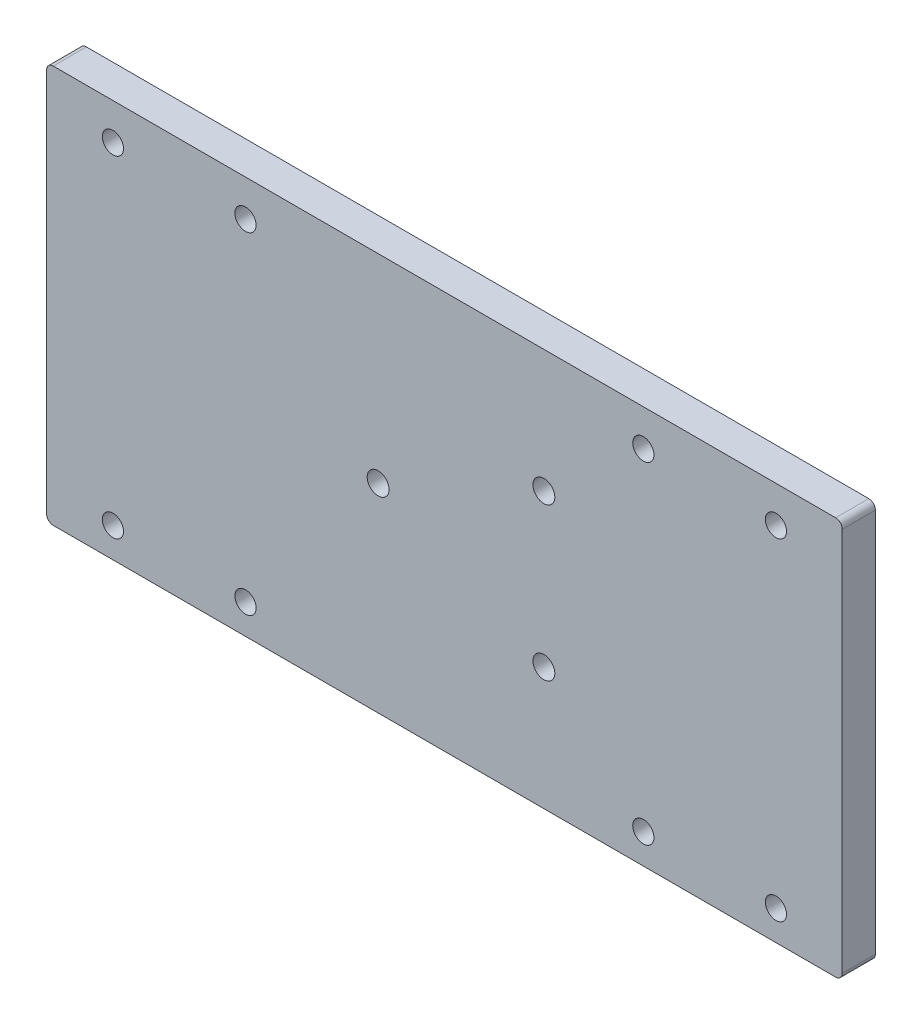
ISO-10303-21;
HEADER;
FILE_DESCRIPTION(('STEP AP214'),'2;1');
FILE_NAME('part.step','',(''),(''),'','','');
FILE_SCHEMA(('AUTOMOTIVE_DESIGN { 1 0 10303 214 1 1 1 1 }'));
ENDSEC;
DATA;
#1=APPLICATION_CONTEXT('core data for automotive mechanical design processes');
#2=APPLICATION_PROTOCOL_DEFINITION('international standard','automotive_design',2000,#1);
#3=PRODUCT_CONTEXT('',#1,'mechanical');
#4=PRODUCT('Part','Part','',(#3));
#5=PRODUCT_RELATED_PRODUCT_CATEGORY('part','',(#4));
#6=PRODUCT_DEFINITION_FORMATION('','',#4);
#7=PRODUCT_DEFINITION_CONTEXT('part definition',#1,'design');
#8=PRODUCT_DEFINITION('design','',#6,#7);
#9=PRODUCT_DEFINITION_SHAPE('','',#8);
#10=(LENGTH_UNIT() NAMED_UNIT(*) SI_UNIT(.MILLI.,.METRE.));
#11=(NAMED_UNIT(*) PLANE_ANGLE_UNIT() SI_UNIT($,.RADIAN.));
#12=(NAMED_UNIT(*) SI_UNIT($,.STERADIAN.) SOLID_ANGLE_UNIT());
#13=UNCERTAINTY_MEASURE_WITH_UNIT(LENGTH_MEASURE(1.E-05),#10,'distance_accuracy_value','');
#14=(GEOMETRIC_REPRESENTATION_CONTEXT(3) GLOBAL_UNCERTAINTY_ASSIGNED_CONTEXT((#13)) GLOBAL_UNIT_ASSIGNED_CONTEXT((#10,
#11,#12)) REPRESENTATION_CONTEXT('',''));
#15=CARTESIAN_POINT('',(0.,0.,0.));
#16=DIRECTION('',(0.,0.,1.));
#17=DIRECTION('',(1.,0.,0.));
#18=AXIS2_PLACEMENT_3D('',#15,#16,#17);
#19=CARTESIAN_POINT('',(20.,5.50000000000001,5.));
#20=DIRECTION('',(-1.,0.,0.));
#21=DIRECTION('',(0.,0.,1.));
#22=AXIS2_PLACEMENT_3D('',#19,#20,#21);
#23=PLANE('',#22);
#24=DIRECTION('',(0.,1.,0.));
#25=VECTOR('',#24,1.);
#26=CARTESIAN_POINT('',(20.,5.50000000000001,5.));
#27=LINE('',#26,#25);
#28=CARTESIAN_POINT('',(20.,-53.5,5.));
#29=VERTEX_POINT('',#28);
#30=CARTESIAN_POINT('',(20.,4.5,5.));
#31=VERTEX_POINT('',#30);
#32=EDGE_CURVE('E131',#29,#31,#27,.T.);
#33=ORIENTED_EDGE('',*,*,#32,.F.);
#34=DIRECTION('',(0.,0.,-1.));
#35=VECTOR('',#34,1.);
#36=CARTESIAN_POINT('',(20.,-53.5,5.));
#37=LINE('',#36,#35);
#38=CARTESIAN_POINT('',(20.,-53.5,0.));
#39=VERTEX_POINT('',#38);
#40=EDGE_CURVE('E116',#29,#39,#37,.T.);
#41=ORIENTED_EDGE('',*,*,#40,.T.);
#42=DIRECTION('',(0.,1.,0.));
#43=VECTOR('',#42,1.);
#44=CARTESIAN_POINT('',(20.,5.50000000000001,0.));
#45=LINE('',#44,#43);
#46=CARTESIAN_POINT('',(20.,4.5,0.));
#47=VERTEX_POINT('',#46);
#48=EDGE_CURVE('E128',#39,#47,#45,.T.);
#49=ORIENTED_EDGE('',*,*,#48,.T.);
#50=DIRECTION('',(0.,0.,-1.));
#51=VECTOR('',#50,1.);
#52=CARTESIAN_POINT('',(20.,4.5,5.));
#53=LINE('',#52,#51);
#54=EDGE_CURVE('E133',#47,#31,#53,.F.);
#55=ORIENTED_EDGE('',*,*,#54,.T.);
#56=EDGE_LOOP('',(#33,#41,#49,#55));
#57=FACE_BOUND('',#56,.T.);
#58=ADVANCED_FACE('F45',(#57),#23,.F.);
#59=CARTESIAN_POINT('',(20.,5.50000000000001,5.));
#60=DIRECTION('',(0.,-1.,0.));
#61=DIRECTION('',(1.,0.,0.));
#62=AXIS2_PLACEMENT_3D('',#59,#60,#61);
#63=PLANE('',#62);
#64=DIRECTION('',(-1.,0.,0.));
#65=VECTOR('',#64,1.);
#66=CARTESIAN_POINT('',(20.,5.50000000000001,5.));
#67=LINE('',#66,#65);
#68=CARTESIAN_POINT('',(19.,5.50000000000001,5.));
#69=VERTEX_POINT('',#68);
#70=CARTESIAN_POINT('',(-99.,5.50000000000002,5.));
#71=VERTEX_POINT('',#70);
#72=EDGE_CURVE('E175',#69,#71,#67,.T.);
#73=ORIENTED_EDGE('',*,*,#72,.F.);
#74=DIRECTION('',(0.,0.,-1.));
#75=VECTOR('',#74,1.);
#76=CARTESIAN_POINT('',(19.,5.50000000000001,5.));
#77=LINE('',#76,#75);
#78=CARTESIAN_POINT('',(19.,5.50000000000001,0.));
#79=VERTEX_POINT('',#78);
#80=EDGE_CURVE('E11',#69,#79,#77,.T.);
#81=ORIENTED_EDGE('',*,*,#80,.T.);
#82=DIRECTION('',(-1.,0.,0.));
#83=VECTOR('',#82,1.);
#84=CARTESIAN_POINT('',(20.,5.50000000000001,0.));
#85=LINE('',#84,#83);
#86=CARTESIAN_POINT('',(-99.,5.50000000000002,0.));
#87=VERTEX_POINT('',#86);
#88=EDGE_CURVE('E138',#79,#87,#85,.T.);
#89=ORIENTED_EDGE('',*,*,#88,.T.);
#90=DIRECTION('',(0.,0.,-1.));
#91=VECTOR('',#90,1.);
#92=CARTESIAN_POINT('',(-99.,5.50000000000002,5.));
#93=LINE('',#92,#91);
#94=EDGE_CURVE('E53',#87,#71,#93,.F.);
#95=ORIENTED_EDGE('',*,*,#94,.T.);
#96=EDGE_LOOP('',(#73,#81,#89,#95));
#97=FACE_BOUND('',#96,.T.);
#98=ADVANCED_FACE('F174',(#97),#63,.F.);
#99=CARTESIAN_POINT('',(-100.,5.50000000000002,5.));
#100=DIRECTION('',(1.,0.,0.));
#101=DIRECTION('',(0.,0.,-1.));
#102=AXIS2_PLACEMENT_3D('',#99,#100,#101);
#103=PLANE('',#102);
#104=DIRECTION('',(0.,-1.,0.));
#105=VECTOR('',#104,1.);
#106=CARTESIAN_POINT('',(-100.,5.50000000000002,0.));
#107=LINE('',#106,#105);
#108=CARTESIAN_POINT('',(-100.,4.50000000000002,0.));
#109=VERTEX_POINT('',#108);
#110=CARTESIAN_POINT('',(-100.,-53.5,0.));
#111=VERTEX_POINT('',#110);
#112=EDGE_CURVE('E142',#109,#111,#107,.T.);
#113=ORIENTED_EDGE('',*,*,#112,.T.);
#114=DIRECTION('',(0.,0.,-1.));
#115=VECTOR('',#114,1.);
#116=CARTESIAN_POINT('',(-100.,-53.5,5.));
#117=LINE('',#116,#115);
#118=CARTESIAN_POINT('',(-100.,-53.5,5.));
#119=VERTEX_POINT('',#118);
#120=EDGE_CURVE('E60',#111,#119,#117,.F.);
#121=ORIENTED_EDGE('',*,*,#120,.T.);
#122=DIRECTION('',(0.,-1.,0.));
#123=VECTOR('',#122,1.);
#124=CARTESIAN_POINT('',(-100.,5.50000000000002,5.));
#125=LINE('',#124,#123);
#126=CARTESIAN_POINT('',(-100.,4.50000000000002,5.));
#127=VERTEX_POINT('',#126);
#128=EDGE_CURVE('E181',#127,#119,#125,.T.);
#129=ORIENTED_EDGE('',*,*,#128,.F.);
#130=DIRECTION('',(0.,0.,-1.));
#131=VECTOR('',#130,1.);
#132=CARTESIAN_POINT('',(-100.,4.50000000000002,5.));
#133=LINE('',#132,#131);
#134=EDGE_CURVE('E168',#127,#109,#133,.T.);
#135=ORIENTED_EDGE('',*,*,#134,.T.);
#136=EDGE_LOOP('',(#113,#121,#129,#135));
#137=FACE_BOUND('',#136,.T.);
#138=ADVANCED_FACE('F185',(#137),#103,.F.);
#139=CARTESIAN_POINT('',(20.,-54.5,5.));
#140=DIRECTION('',(0.,1.,0.));
#141=DIRECTION('',(-1.,0.,0.));
#142=AXIS2_PLACEMENT_3D('',#139,#140,#141);
#143=PLANE('',#142);
#144=DIRECTION('',(1.,0.,0.));
#145=VECTOR('',#144,1.);
#146=CARTESIAN_POINT('',(20.,-54.5,0.));
#147=LINE('',#146,#145);
#148=CARTESIAN_POINT('',(-99.,-54.5,0.));
#149=VERTEX_POINT('',#148);
#150=CARTESIAN_POINT('',(19.,-54.5,0.));
#151=VERTEX_POINT('',#150);
#152=EDGE_CURVE('E152',#149,#151,#147,.T.);
#153=ORIENTED_EDGE('',*,*,#152,.T.);
#154=DIRECTION('',(0.,0.,-1.));
#155=VECTOR('',#154,1.);
#156=CARTESIAN_POINT('',(19.,-54.5,5.));
#157=LINE('',#156,#155);
#158=CARTESIAN_POINT('',(19.,-54.5,5.));
#159=VERTEX_POINT('',#158);
#160=EDGE_CURVE('E117',#151,#159,#157,.F.);
#161=ORIENTED_EDGE('',*,*,#160,.T.);
#162=DIRECTION('',(1.,0.,0.));
#163=VECTOR('',#162,1.);
#164=CARTESIAN_POINT('',(20.,-54.5,5.));
#165=LINE('',#164,#163);
#166=CARTESIAN_POINT('',(-99.,-54.5,5.));
#167=VERTEX_POINT('',#166);
#168=EDGE_CURVE('E148',#167,#159,#165,.T.);
#169=ORIENTED_EDGE('',*,*,#168,.F.);
#170=DIRECTION('',(0.,0.,-1.));
#171=VECTOR('',#170,1.);
#172=CARTESIAN_POINT('',(-99.,-54.5,5.));
#173=LINE('',#172,#171);
#174=EDGE_CURVE('E122',#167,#149,#173,.T.);
#175=ORIENTED_EDGE('',*,*,#174,.T.);
#176=EDGE_LOOP('',(#153,#161,#169,#175));
#177=FACE_BOUND('',#176,.T.);
#178=ADVANCED_FACE('F192',(#177),#143,.F.);
#179=CARTESIAN_POINT('',(0.,0.,5.));
#180=DIRECTION('',(0.,0.,-1.));
#181=DIRECTION('',(-1.,0.,0.));
#182=AXIS2_PLACEMENT_3D('',#179,#180,#181);
#183=PLANE('',#182);
#184=CARTESIAN_POINT('',(-10.,-50.,5.));
#185=DIRECTION('',(0.,0.,-1.));
#186=DIRECTION('',(-1.,0.,0.));
#187=AXIS2_PLACEMENT_3D('',#184,#185,#186);
#188=CIRCLE('',#187,1.6);
#189=CARTESIAN_POINT('',(-11.6,-50.,5.));
#190=VERTEX_POINT('',#189);
#191=EDGE_CURVE('E232',#190,#190,#188,.F.);
#192=ORIENTED_EDGE('',*,*,#191,.F.);
#193=EDGE_LOOP('',(#192));
#194=FACE_BOUND('',#193,.T.);
#195=CARTESIAN_POINT('',(-90.,-50.,5.));
#196=DIRECTION('',(0.,0.,-1.));
#197=DIRECTION('',(-1.,0.,0.));
#198=AXIS2_PLACEMENT_3D('',#195,#196,#197);
#199=CIRCLE('',#198,1.59999999999999);
#200=CARTESIAN_POINT('',(-91.6,-50.,5.));
#201=VERTEX_POINT('',#200);
#202=EDGE_CURVE('E231',#201,#201,#199,.F.);
#203=ORIENTED_EDGE('',*,*,#202,.F.);
#204=EDGE_LOOP('',(#203));
#205=FACE_BOUND('',#204,.T.);
#206=CARTESIAN_POINT('',(-70.,-50.,5.));
#207=DIRECTION('',(0.,0.,-1.));
#208=DIRECTION('',(-1.,0.,0.));
#209=AXIS2_PLACEMENT_3D('',#206,#207,#208);
#210=CIRCLE('',#209,1.59999999999999);
#211=CARTESIAN_POINT('',(-71.6,-50.,5.));
#212=VERTEX_POINT('',#211);
#213=EDGE_CURVE('E220',#212,#212,#210,.F.);
#214=ORIENTED_EDGE('',*,*,#213,.F.);
#215=EDGE_LOOP('',(#214));
#216=FACE_BOUND('',#215,.T.);
#217=CARTESIAN_POINT('',(-70.,0.,5.));
#218=DIRECTION('',(0.,0.,-1.));
#219=DIRECTION('',(-1.,0.,0.));
#220=AXIS2_PLACEMENT_3D('',#217,#218,#219);
#221=CIRCLE('',#220,1.60000000000001);
#222=CARTESIAN_POINT('',(-71.6,0.,5.));
#223=VERTEX_POINT('',#222);
#224=EDGE_CURVE('E219',#223,#223,#221,.F.);
#225=ORIENTED_EDGE('',*,*,#224,.F.);
#226=EDGE_LOOP('',(#225));
#227=FACE_BOUND('',#226,.T.);
#228=CARTESIAN_POINT('',(9.99999999999999,-50.,5.));
#229=DIRECTION('',(0.,0.,-1.));
#230=DIRECTION('',(-1.,0.,0.));
#231=AXIS2_PLACEMENT_3D('',#228,#229,#230);
#232=CIRCLE('',#231,1.6);
#233=CARTESIAN_POINT('',(8.4,-50.,5.));
#234=VERTEX_POINT('',#233);
#235=EDGE_CURVE('E250',#234,#234,#232,.F.);
#236=ORIENTED_EDGE('',*,*,#235,.F.);
#237=EDGE_LOOP('',(#236));
#238=FACE_BOUND('',#237,.T.);
#239=CARTESIAN_POINT('',(10.,0.,5.));
#240=DIRECTION('',(0.,0.,-1.));
#241=DIRECTION('',(-1.,0.,0.));
#242=AXIS2_PLACEMENT_3D('',#239,#240,#241);
#243=CIRCLE('',#242,1.6);
#244=CARTESIAN_POINT('',(8.4,0.,5.));
#245=VERTEX_POINT('',#244);
#246=EDGE_CURVE('E243',#245,#245,#243,.F.);
#247=ORIENTED_EDGE('',*,*,#246,.F.);
#248=EDGE_LOOP('',(#247));
#249=FACE_BOUND('',#248,.T.);
#250=CARTESIAN_POINT('',(-10.,0.,5.));
#251=DIRECTION('',(0.,0.,-1.));
#252=DIRECTION('',(-1.,0.,0.));
#253=AXIS2_PLACEMENT_3D('',#250,#251,#252);
#254=CIRCLE('',#253,1.6);
#255=CARTESIAN_POINT('',(-11.6,0.,5.));
#256=VERTEX_POINT('',#255);
#257=EDGE_CURVE('E244',#256,#256,#254,.F.);
#258=ORIENTED_EDGE('',*,*,#257,.F.);
#259=EDGE_LOOP('',(#258));
#260=FACE_BOUND('',#259,.T.);
#261=CARTESIAN_POINT('',(-90.,0.,5.));
#262=DIRECTION('',(0.,0.,-1.));
#263=DIRECTION('',(-1.,0.,0.));
#264=AXIS2_PLACEMENT_3D('',#261,#262,#263);
#265=CIRCLE('',#264,1.60000000000001);
#266=CARTESIAN_POINT('',(-91.6,0.,5.));
#267=VERTEX_POINT('',#266);
#268=EDGE_CURVE('E199',#267,#267,#265,.F.);
#269=ORIENTED_EDGE('',*,*,#268,.F.);
#270=EDGE_LOOP('',(#269));
#271=FACE_BOUND('',#270,.T.);
#272=CARTESIAN_POINT('',(-25.,-13.,5.));
#273=DIRECTION('',(0.,0.,1.));
#274=DIRECTION('',(1.,0.,0.));
#275=AXIS2_PLACEMENT_3D('',#272,#273,#274);
#276=CIRCLE('',#275,1.65);
#277=CARTESIAN_POINT('',(-23.35,-13.,5.));
#278=VERTEX_POINT('',#277);
#279=EDGE_CURVE('E139',#278,#278,#276,.T.);
#280=ORIENTED_EDGE('',*,*,#279,.F.);
#281=EDGE_LOOP('',(#280));
#282=FACE_BOUND('',#281,.T.);
#283=CARTESIAN_POINT('',(-50.,-24.5,5.));
#284=DIRECTION('',(0.,0.,1.));
#285=DIRECTION('',(1.,0.,0.));
#286=AXIS2_PLACEMENT_3D('',#283,#284,#285);
#287=CIRCLE('',#286,1.65);
#288=CARTESIAN_POINT('',(-48.35,-24.5,5.));
#289=VERTEX_POINT('',#288);
#290=EDGE_CURVE('E202',#289,#289,#287,.T.);
#291=ORIENTED_EDGE('',*,*,#290,.F.);
#292=EDGE_LOOP('',(#291));
#293=FACE_BOUND('',#292,.T.);
#294=CARTESIAN_POINT('',(-25.,-36.,5.));
#295=DIRECTION('',(0.,0.,1.));
#296=DIRECTION('',(1.,0.,0.));
#297=AXIS2_PLACEMENT_3D('',#294,#295,#296);
#298=CIRCLE('',#297,1.65000000000001);
#299=CARTESIAN_POINT('',(-23.35,-36.,5.));
#300=VERTEX_POINT('',#299);
#301=EDGE_CURVE('E195',#300,#300,#298,.T.);
#302=ORIENTED_EDGE('',*,*,#301,.F.);
#303=EDGE_LOOP('',(#302));
#304=FACE_BOUND('',#303,.T.);
#305=ORIENTED_EDGE('',*,*,#168,.T.);
#306=CARTESIAN_POINT('',(19.,-53.5,5.));
#307=DIRECTION('',(0.,0.,-1.));
#308=DIRECTION('',(-1.,0.,0.));
#309=AXIS2_PLACEMENT_3D('',#306,#307,#308);
#310=CIRCLE('',#309,1.);
#311=EDGE_CURVE('E166',#159,#29,#310,.F.);
#312=ORIENTED_EDGE('',*,*,#311,.T.);
#313=ORIENTED_EDGE('',*,*,#32,.T.);
#314=CARTESIAN_POINT('',(19.,4.5,5.));
#315=DIRECTION('',(0.,0.,-1.));
#316=DIRECTION('',(-1.,0.,0.));
#317=AXIS2_PLACEMENT_3D('',#314,#315,#316);
#318=CIRCLE('',#317,1.);
#319=EDGE_CURVE('E162',#31,#69,#318,.F.);
#320=ORIENTED_EDGE('',*,*,#319,.T.);
#321=ORIENTED_EDGE('',*,*,#72,.T.);
#322=CARTESIAN_POINT('',(-99.,4.50000000000002,5.));
#323=DIRECTION('',(0.,0.,-1.));
#324=DIRECTION('',(-1.,0.,0.));
#325=AXIS2_PLACEMENT_3D('',#322,#323,#324);
#326=CIRCLE('',#325,1.);
#327=EDGE_CURVE('E67',#71,#127,#326,.F.);
#328=ORIENTED_EDGE('',*,*,#327,.T.);
#329=ORIENTED_EDGE('',*,*,#128,.T.);
#330=CARTESIAN_POINT('',(-99.,-53.5,5.));
#331=DIRECTION('',(0.,0.,-1.));
#332=DIRECTION('',(-1.,0.,0.));
#333=AXIS2_PLACEMENT_3D('',#330,#331,#332);
#334=CIRCLE('',#333,1.);
#335=EDGE_CURVE('E164',#119,#167,#334,.F.);
#336=ORIENTED_EDGE('',*,*,#335,.T.);
#337=EDGE_LOOP('',(#305,#312,#313,#320,#321,#328,#329,#336));
#338=FACE_BOUND('',#337,.T.);
#339=ADVANCED_FACE('F179',(#194,#205,#216,#227,#238,#249,#260,#271,#282,#293,#304,#338),#183,.F.);
#340=CARTESIAN_POINT('',(0.,0.,0.));
#341=DIRECTION('',(0.,0.,-1.));
#342=DIRECTION('',(-1.,0.,0.));
#343=AXIS2_PLACEMENT_3D('',#340,#341,#342);
#344=PLANE('',#343);
#345=CARTESIAN_POINT('',(-10.,-50.,0.));
#346=DIRECTION('',(0.,0.,-1.));
#347=DIRECTION('',(-1.,0.,0.));
#348=AXIS2_PLACEMENT_3D('',#345,#346,#347);
#349=CIRCLE('',#348,1.6);
#350=CARTESIAN_POINT('',(-11.6,-50.,0.));
#351=VERTEX_POINT('',#350);
#352=EDGE_CURVE('E228',#351,#351,#349,.T.);
#353=ORIENTED_EDGE('',*,*,#352,.F.);
#354=EDGE_LOOP('',(#353));
#355=FACE_BOUND('',#354,.T.);
#356=CARTESIAN_POINT('',(-90.,-50.,0.));
#357=DIRECTION('',(0.,0.,-1.));
#358=DIRECTION('',(-1.,0.,0.));
#359=AXIS2_PLACEMENT_3D('',#356,#357,#358);
#360=CIRCLE('',#359,1.59999999999999);
#361=CARTESIAN_POINT('',(-91.6,-50.,0.));
#362=VERTEX_POINT('',#361);
#363=EDGE_CURVE('E223',#362,#362,#360,.T.);
#364=ORIENTED_EDGE('',*,*,#363,.F.);
#365=EDGE_LOOP('',(#364));
#366=FACE_BOUND('',#365,.T.);
#367=CARTESIAN_POINT('',(-70.,-50.,0.));
#368=DIRECTION('',(0.,0.,-1.));
#369=DIRECTION('',(-1.,0.,0.));
#370=AXIS2_PLACEMENT_3D('',#367,#368,#369);
#371=CIRCLE('',#370,1.59999999999999);
#372=CARTESIAN_POINT('',(-71.6,-50.,0.));
#373=VERTEX_POINT('',#372);
#374=EDGE_CURVE('E216',#373,#373,#371,.T.);
#375=ORIENTED_EDGE('',*,*,#374,.F.);
#376=EDGE_LOOP('',(#375));
#377=FACE_BOUND('',#376,.T.);
#378=CARTESIAN_POINT('',(-70.,0.,0.));
#379=DIRECTION('',(0.,0.,-1.));
#380=DIRECTION('',(-1.,0.,0.));
#381=AXIS2_PLACEMENT_3D('',#378,#379,#380);
#382=CIRCLE('',#381,1.60000000000001);
#383=CARTESIAN_POINT('',(-71.6,0.,0.));
#384=VERTEX_POINT('',#383);
#385=EDGE_CURVE('E215',#384,#384,#382,.T.);
#386=ORIENTED_EDGE('',*,*,#385,.F.);
#387=EDGE_LOOP('',(#386));
#388=FACE_BOUND('',#387,.T.);
#389=CARTESIAN_POINT('',(9.99999999999999,-50.,0.));
#390=DIRECTION('',(0.,0.,-1.));
#391=DIRECTION('',(-1.,0.,0.));
#392=AXIS2_PLACEMENT_3D('',#389,#390,#391);
#393=CIRCLE('',#392,1.6);
#394=CARTESIAN_POINT('',(8.4,-50.,0.));
#395=VERTEX_POINT('',#394);
#396=EDGE_CURVE('E235',#395,#395,#393,.T.);
#397=ORIENTED_EDGE('',*,*,#396,.F.);
#398=EDGE_LOOP('',(#397));
#399=FACE_BOUND('',#398,.T.);
#400=CARTESIAN_POINT('',(10.,0.,0.));
#401=DIRECTION('',(0.,0.,-1.));
#402=DIRECTION('',(-1.,0.,0.));
#403=AXIS2_PLACEMENT_3D('',#400,#401,#402);
#404=CIRCLE('',#403,1.6);
#405=CARTESIAN_POINT('',(8.4,0.,0.));
#406=VERTEX_POINT('',#405);
#407=EDGE_CURVE('E247',#406,#406,#404,.T.);
#408=ORIENTED_EDGE('',*,*,#407,.F.);
#409=EDGE_LOOP('',(#408));
#410=FACE_BOUND('',#409,.T.);
#411=CARTESIAN_POINT('',(-10.,0.,0.));
#412=DIRECTION('',(0.,0.,-1.));
#413=DIRECTION('',(-1.,0.,0.));
#414=AXIS2_PLACEMENT_3D('',#411,#412,#413);
#415=CIRCLE('',#414,1.6);
#416=CARTESIAN_POINT('',(-11.6,0.,0.));
#417=VERTEX_POINT('',#416);
#418=EDGE_CURVE('E240',#417,#417,#415,.T.);
#419=ORIENTED_EDGE('',*,*,#418,.F.);
#420=EDGE_LOOP('',(#419));
#421=FACE_BOUND('',#420,.T.);
#422=CARTESIAN_POINT('',(-90.,0.,0.));
#423=DIRECTION('',(0.,0.,-1.));
#424=DIRECTION('',(-1.,0.,0.));
#425=AXIS2_PLACEMENT_3D('',#422,#423,#424);
#426=CIRCLE('',#425,1.60000000000001);
#427=CARTESIAN_POINT('',(-91.6,0.,0.));
#428=VERTEX_POINT('',#427);
#429=EDGE_CURVE('E212',#428,#428,#426,.T.);
#430=ORIENTED_EDGE('',*,*,#429,.F.);
#431=EDGE_LOOP('',(#430));
#432=FACE_BOUND('',#431,.T.);
#433=CARTESIAN_POINT('',(-25.,-13.,0.));
#434=DIRECTION('',(0.,0.,-1.));
#435=DIRECTION('',(-1.,0.,0.));
#436=AXIS2_PLACEMENT_3D('',#433,#434,#435);
#437=CIRCLE('',#436,1.65);
#438=CARTESIAN_POINT('',(-26.65,-13.,0.));
#439=VERTEX_POINT('',#438);
#440=EDGE_CURVE('E145',#439,#439,#437,.F.);
#441=ORIENTED_EDGE('',*,*,#440,.T.);
#442=EDGE_LOOP('',(#441));
#443=FACE_BOUND('',#442,.T.);
#444=CARTESIAN_POINT('',(-50.,-24.5,0.));
#445=DIRECTION('',(0.,0.,-1.));
#446=DIRECTION('',(-1.,0.,0.));
#447=AXIS2_PLACEMENT_3D('',#444,#445,#446);
#448=CIRCLE('',#447,1.65);
#449=CARTESIAN_POINT('',(-51.65,-24.5,0.));
#450=VERTEX_POINT('',#449);
#451=EDGE_CURVE('E205',#450,#450,#448,.F.);
#452=ORIENTED_EDGE('',*,*,#451,.T.);
#453=EDGE_LOOP('',(#452));
#454=FACE_BOUND('',#453,.T.);
#455=CARTESIAN_POINT('',(-25.,-36.,0.));
#456=DIRECTION('',(0.,0.,-1.));
#457=DIRECTION('',(-1.,0.,0.));
#458=AXIS2_PLACEMENT_3D('',#455,#456,#457);
#459=CIRCLE('',#458,1.65000000000001);
#460=CARTESIAN_POINT('',(-26.65,-36.,0.));
#461=VERTEX_POINT('',#460);
#462=EDGE_CURVE('E198',#461,#461,#459,.F.);
#463=ORIENTED_EDGE('',*,*,#462,.T.);
#464=EDGE_LOOP('',(#463));
#465=FACE_BOUND('',#464,.T.);
#466=ORIENTED_EDGE('',*,*,#48,.F.);
#467=CARTESIAN_POINT('',(19.,-53.5,0.));
#468=DIRECTION('',(0.,0.,-1.));
#469=DIRECTION('',(-1.,0.,0.));
#470=AXIS2_PLACEMENT_3D('',#467,#468,#469);
#471=CIRCLE('',#470,1.);
#472=EDGE_CURVE('E112',#39,#151,#471,.T.);
#473=ORIENTED_EDGE('',*,*,#472,.T.);
#474=ORIENTED_EDGE('',*,*,#152,.F.);
#475=CARTESIAN_POINT('',(-99.,-53.5,0.));
#476=DIRECTION('',(0.,0.,-1.));
#477=DIRECTION('',(-1.,0.,0.));
#478=AXIS2_PLACEMENT_3D('',#475,#476,#477);
#479=CIRCLE('',#478,1.);
#480=EDGE_CURVE('E123',#149,#111,#479,.T.);
#481=ORIENTED_EDGE('',*,*,#480,.T.);
#482=ORIENTED_EDGE('',*,*,#112,.F.);
#483=CARTESIAN_POINT('',(-99.,4.50000000000002,0.));
#484=DIRECTION('',(0.,0.,-1.));
#485=DIRECTION('',(-1.,0.,0.));
#486=AXIS2_PLACEMENT_3D('',#483,#484,#485);
#487=CIRCLE('',#486,1.);
#488=EDGE_CURVE('E132',#109,#87,#487,.T.);
#489=ORIENTED_EDGE('',*,*,#488,.T.);
#490=ORIENTED_EDGE('',*,*,#88,.F.);
#491=CARTESIAN_POINT('',(19.,4.5,0.));
#492=DIRECTION('',(0.,0.,-1.));
#493=DIRECTION('',(-1.,0.,0.));
#494=AXIS2_PLACEMENT_3D('',#491,#492,#493);
#495=CIRCLE('',#494,1.);
#496=EDGE_CURVE('E137',#79,#47,#495,.T.);
#497=ORIENTED_EDGE('',*,*,#496,.T.);
#498=EDGE_LOOP('',(#466,#473,#474,#481,#482,#489,#490,#497));
#499=FACE_BOUND('',#498,.T.);
#500=ADVANCED_FACE('F135',(#355,#366,#377,#388,#399,#410,#421,#432,#443,#454,#465,#499),#344,.T.);
#501=CARTESIAN_POINT('',(-25.,-36.,-0.00100000000000013));
#502=DIRECTION('',(0.,0.,1.));
#503=DIRECTION('',(1.,0.,0.));
#504=AXIS2_PLACEMENT_3D('',#501,#502,#503);
#505=CYLINDRICAL_SURFACE('',#504,1.65000000000001);
#506=ORIENTED_EDGE('',*,*,#462,.F.);
#507=EDGE_LOOP('',(#506));
#508=FACE_BOUND('',#507,.T.);
#509=ORIENTED_EDGE('',*,*,#301,.T.);
#510=EDGE_LOOP('',(#509));
#511=FACE_BOUND('',#510,.T.);
#512=ADVANCED_FACE('F276',(#508,#511),#505,.F.);
#513=CARTESIAN_POINT('',(-50.,-24.5,-0.00100000000000013));
#514=DIRECTION('',(0.,0.,1.));
#515=DIRECTION('',(1.,0.,0.));
#516=AXIS2_PLACEMENT_3D('',#513,#514,#515);
#517=CYLINDRICAL_SURFACE('',#516,1.65);
#518=ORIENTED_EDGE('',*,*,#451,.F.);
#519=EDGE_LOOP('',(#518));
#520=FACE_BOUND('',#519,.T.);
#521=ORIENTED_EDGE('',*,*,#290,.T.);
#522=EDGE_LOOP('',(#521));
#523=FACE_BOUND('',#522,.T.);
#524=ADVANCED_FACE('F278',(#520,#523),#517,.F.);
#525=CARTESIAN_POINT('',(-25.,-13.,-0.00100000000000013));
#526=DIRECTION('',(0.,0.,1.));
#527=DIRECTION('',(1.,0.,0.));
#528=AXIS2_PLACEMENT_3D('',#525,#526,#527);
#529=CYLINDRICAL_SURFACE('',#528,1.65);
#530=ORIENTED_EDGE('',*,*,#440,.F.);
#531=EDGE_LOOP('',(#530));
#532=FACE_BOUND('',#531,.T.);
#533=ORIENTED_EDGE('',*,*,#279,.T.);
#534=EDGE_LOOP('',(#533));
#535=FACE_BOUND('',#534,.T.);
#536=ADVANCED_FACE('F284',(#532,#535),#529,.F.);
#537=CARTESIAN_POINT('',(-90.,0.,5.001));
#538=DIRECTION('',(0.,0.,-1.));
#539=DIRECTION('',(-1.,0.,0.));
#540=AXIS2_PLACEMENT_3D('',#537,#538,#539);
#541=CYLINDRICAL_SURFACE('',#540,1.60000000000001);
#542=ORIENTED_EDGE('',*,*,#429,.T.);
#543=EDGE_LOOP('',(#542));
#544=FACE_BOUND('',#543,.T.);
#545=ORIENTED_EDGE('',*,*,#268,.T.);
#546=EDGE_LOOP('',(#545));
#547=FACE_BOUND('',#546,.T.);
#548=ADVANCED_FACE('F396',(#544,#547),#541,.F.);
#549=CARTESIAN_POINT('',(-10.,0.,5.001));
#550=DIRECTION('',(0.,0.,-1.));
#551=DIRECTION('',(-1.,0.,0.));
#552=AXIS2_PLACEMENT_3D('',#549,#550,#551);
#553=CYLINDRICAL_SURFACE('',#552,1.6);
#554=ORIENTED_EDGE('',*,*,#418,.T.);
#555=EDGE_LOOP('',(#554));
#556=FACE_BOUND('',#555,.T.);
#557=ORIENTED_EDGE('',*,*,#257,.T.);
#558=EDGE_LOOP('',(#557));
#559=FACE_BOUND('',#558,.T.);
#560=ADVANCED_FACE('F386',(#556,#559),#553,.F.);
#561=CARTESIAN_POINT('',(10.,0.,5.001));
#562=DIRECTION('',(0.,0.,-1.));
#563=DIRECTION('',(-1.,0.,0.));
#564=AXIS2_PLACEMENT_3D('',#561,#562,#563);
#565=CYLINDRICAL_SURFACE('',#564,1.6);
#566=ORIENTED_EDGE('',*,*,#407,.T.);
#567=EDGE_LOOP('',(#566));
#568=FACE_BOUND('',#567,.T.);
#569=ORIENTED_EDGE('',*,*,#246,.T.);
#570=EDGE_LOOP('',(#569));
#571=FACE_BOUND('',#570,.T.);
#572=ADVANCED_FACE('F376',(#568,#571),#565,.F.);
#573=CARTESIAN_POINT('',(9.99999999999999,-50.,5.001));
#574=DIRECTION('',(0.,0.,-1.));
#575=DIRECTION('',(-1.,0.,0.));
#576=AXIS2_PLACEMENT_3D('',#573,#574,#575);
#577=CYLINDRICAL_SURFACE('',#576,1.6);
#578=ORIENTED_EDGE('',*,*,#396,.T.);
#579=EDGE_LOOP('',(#578));
#580=FACE_BOUND('',#579,.T.);
#581=ORIENTED_EDGE('',*,*,#235,.T.);
#582=EDGE_LOOP('',(#581));
#583=FACE_BOUND('',#582,.T.);
#584=ADVANCED_FACE('F258',(#580,#583),#577,.F.);
#585=CARTESIAN_POINT('',(-70.,0.,5.001));
#586=DIRECTION('',(0.,0.,-1.));
#587=DIRECTION('',(-1.,0.,0.));
#588=AXIS2_PLACEMENT_3D('',#585,#586,#587);
#589=CYLINDRICAL_SURFACE('',#588,1.60000000000001);
#590=ORIENTED_EDGE('',*,*,#385,.T.);
#591=EDGE_LOOP('',(#590));
#592=FACE_BOUND('',#591,.T.);
#593=ORIENTED_EDGE('',*,*,#224,.T.);
#594=EDGE_LOOP('',(#593));
#595=FACE_BOUND('',#594,.T.);
#596=ADVANCED_FACE('F357',(#592,#595),#589,.F.);
#597=CARTESIAN_POINT('',(-70.,-50.,5.001));
#598=DIRECTION('',(0.,0.,-1.));
#599=DIRECTION('',(-1.,0.,0.));
#600=AXIS2_PLACEMENT_3D('',#597,#598,#599);
#601=CYLINDRICAL_SURFACE('',#600,1.59999999999999);
#602=ORIENTED_EDGE('',*,*,#374,.T.);
#603=EDGE_LOOP('',(#602));
#604=FACE_BOUND('',#603,.T.);
#605=ORIENTED_EDGE('',*,*,#213,.T.);
#606=EDGE_LOOP('',(#605));
#607=FACE_BOUND('',#606,.T.);
#608=ADVANCED_FACE('F347',(#604,#607),#601,.F.);
#609=CARTESIAN_POINT('',(-90.,-50.,5.001));
#610=DIRECTION('',(0.,0.,-1.));
#611=DIRECTION('',(-1.,0.,0.));
#612=AXIS2_PLACEMENT_3D('',#609,#610,#611);
#613=CYLINDRICAL_SURFACE('',#612,1.59999999999999);
#614=ORIENTED_EDGE('',*,*,#363,.T.);
#615=EDGE_LOOP('',(#614));
#616=FACE_BOUND('',#615,.T.);
#617=ORIENTED_EDGE('',*,*,#202,.T.);
#618=EDGE_LOOP('',(#617));
#619=FACE_BOUND('',#618,.T.);
#620=ADVANCED_FACE('F337',(#616,#619),#613,.F.);
#621=CARTESIAN_POINT('',(-10.,-50.,5.001));
#622=DIRECTION('',(0.,0.,-1.));
#623=DIRECTION('',(-1.,0.,0.));
#624=AXIS2_PLACEMENT_3D('',#621,#622,#623);
#625=CYLINDRICAL_SURFACE('',#624,1.6);
#626=ORIENTED_EDGE('',*,*,#352,.T.);
#627=EDGE_LOOP('',(#626));
#628=FACE_BOUND('',#627,.T.);
#629=ORIENTED_EDGE('',*,*,#191,.T.);
#630=EDGE_LOOP('',(#629));
#631=FACE_BOUND('',#630,.T.);
#632=ADVANCED_FACE('F302',(#628,#631),#625,.F.);
#633=CARTESIAN_POINT('',(19.,-53.5,5.));
#634=DIRECTION('',(0.,0.,-1.));
#635=DIRECTION('',(-1.,0.,0.));
#636=AXIS2_PLACEMENT_3D('',#633,#634,#635);
#637=CYLINDRICAL_SURFACE('',#636,1.);
#638=ORIENTED_EDGE('',*,*,#311,.F.);
#639=ORIENTED_EDGE('',*,*,#160,.F.);
#640=ORIENTED_EDGE('',*,*,#472,.F.);
#641=ORIENTED_EDGE('',*,*,#40,.F.);
#642=EDGE_LOOP('',(#638,#639,#640,#641));
#643=FACE_BOUND('',#642,.T.);
#644=ADVANCED_FACE('F115',(#643),#637,.T.);
#645=CARTESIAN_POINT('',(-99.,-53.5,5.));
#646=DIRECTION('',(0.,0.,-1.));
#647=DIRECTION('',(-1.,0.,0.));
#648=AXIS2_PLACEMENT_3D('',#645,#646,#647);
#649=CYLINDRICAL_SURFACE('',#648,1.);
#650=ORIENTED_EDGE('',*,*,#335,.F.);
#651=ORIENTED_EDGE('',*,*,#120,.F.);
#652=ORIENTED_EDGE('',*,*,#480,.F.);
#653=ORIENTED_EDGE('',*,*,#174,.F.);
#654=EDGE_LOOP('',(#650,#651,#652,#653));
#655=FACE_BOUND('',#654,.T.);
#656=ADVANCED_FACE('F189',(#655),#649,.T.);
#657=CARTESIAN_POINT('',(19.,4.5,5.));
#658=DIRECTION('',(0.,0.,-1.));
#659=DIRECTION('',(-1.,0.,0.));
#660=AXIS2_PLACEMENT_3D('',#657,#658,#659);
#661=CYLINDRICAL_SURFACE('',#660,1.);
#662=ORIENTED_EDGE('',*,*,#319,.F.);
#663=ORIENTED_EDGE('',*,*,#54,.F.);
#664=ORIENTED_EDGE('',*,*,#496,.F.);
#665=ORIENTED_EDGE('',*,*,#80,.F.);
#666=EDGE_LOOP('',(#662,#663,#664,#665));
#667=FACE_BOUND('',#666,.T.);
#668=ADVANCED_FACE('F304',(#667),#661,.T.);
#669=CARTESIAN_POINT('',(-99.,4.50000000000002,5.));
#670=DIRECTION('',(0.,0.,-1.));
#671=DIRECTION('',(-1.,0.,0.));
#672=AXIS2_PLACEMENT_3D('',#669,#670,#671);
#673=CYLINDRICAL_SURFACE('',#672,1.);
#674=ORIENTED_EDGE('',*,*,#327,.F.);
#675=ORIENTED_EDGE('',*,*,#94,.F.);
#676=ORIENTED_EDGE('',*,*,#488,.F.);
#677=ORIENTED_EDGE('',*,*,#134,.F.);
#678=EDGE_LOOP('',(#674,#675,#676,#677));
#679=FACE_BOUND('',#678,.T.);
#680=ADVANCED_FACE('F47',(#679),#673,.T.);
#681=CLOSED_SHELL('',(#58,#98,#138,#178,#339,#500,#512,#524,#536,#548,#560,#572,#584,#596,#608,
#620,#632,#644,#656,#668,#680));
#682=MANIFOLD_SOLID_BREP('B2',#681);
#683=ADVANCED_BREP_SHAPE_REPRESENTATION('',(#18,#682),#14);
#684=SHAPE_DEFINITION_REPRESENTATION(#9,#683);
ENDSEC;
END-ISO-10303-21;
